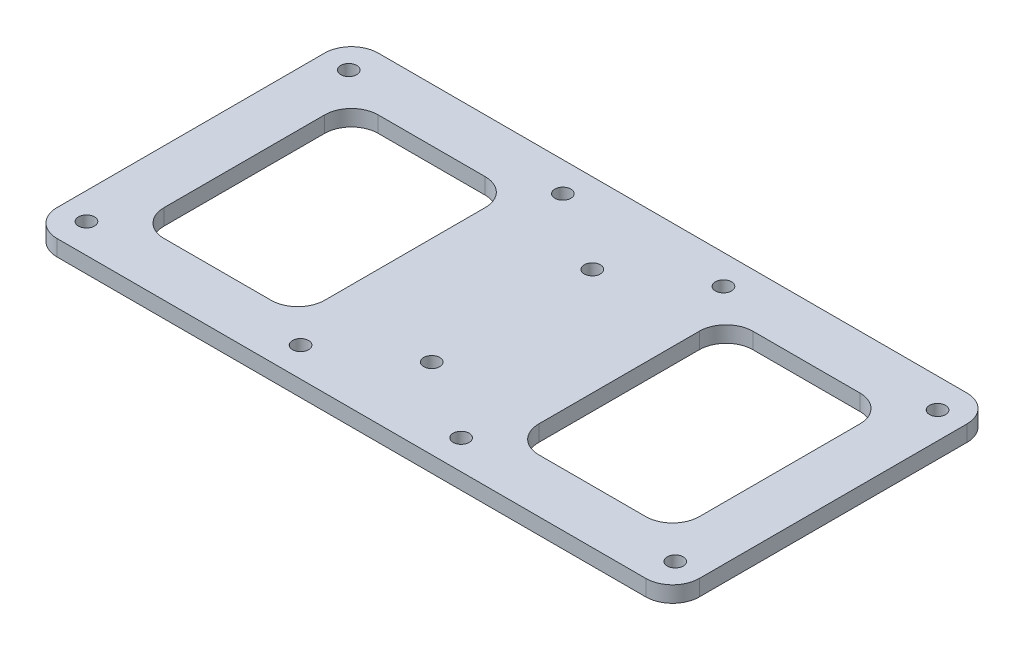
ISO-10303-21;
HEADER;
FILE_DESCRIPTION(('STEP AP214'),'2;1');
FILE_NAME('part.step','',(''),(''),'','','');
FILE_SCHEMA(('AUTOMOTIVE_DESIGN { 1 0 10303 214 1 1 1 1 }'));
ENDSEC;
DATA;
#1=APPLICATION_CONTEXT('core data for automotive mechanical design processes');
#2=APPLICATION_PROTOCOL_DEFINITION('international standard','automotive_design',2000,#1);
#3=PRODUCT_CONTEXT('',#1,'mechanical');
#4=PRODUCT('Part','Part','',(#3));
#5=PRODUCT_RELATED_PRODUCT_CATEGORY('part','',(#4));
#6=PRODUCT_DEFINITION_FORMATION('','',#4);
#7=PRODUCT_DEFINITION_CONTEXT('part definition',#1,'design');
#8=PRODUCT_DEFINITION('design','',#6,#7);
#9=PRODUCT_DEFINITION_SHAPE('','',#8);
#10=(LENGTH_UNIT() NAMED_UNIT(*) SI_UNIT(.MILLI.,.METRE.));
#11=(NAMED_UNIT(*) PLANE_ANGLE_UNIT() SI_UNIT($,.RADIAN.));
#12=(NAMED_UNIT(*) SI_UNIT($,.STERADIAN.) SOLID_ANGLE_UNIT());
#13=UNCERTAINTY_MEASURE_WITH_UNIT(LENGTH_MEASURE(1.E-05),#10,'distance_accuracy_value','');
#14=(GEOMETRIC_REPRESENTATION_CONTEXT(3) GLOBAL_UNCERTAINTY_ASSIGNED_CONTEXT((#13)) GLOBAL_UNIT_ASSIGNED_CONTEXT((#10,
#11,#12)) REPRESENTATION_CONTEXT('',''));
#15=CARTESIAN_POINT('',(0.,0.,0.));
#16=DIRECTION('',(0.,0.,1.));
#17=DIRECTION('',(1.,0.,0.));
#18=AXIS2_PLACEMENT_3D('',#15,#16,#17);
#19=CARTESIAN_POINT('',(60.,3.,30.));
#20=DIRECTION('',(-1.,0.,0.));
#21=DIRECTION('',(0.,0.,1.));
#22=AXIS2_PLACEMENT_3D('',#19,#20,#21);
#23=PLANE('',#22);
#24=DIRECTION('',(0.,0.,-1.));
#25=VECTOR('',#24,1.);
#26=CARTESIAN_POINT('',(60.,3.,30.));
#27=LINE('',#26,#25);
#28=CARTESIAN_POINT('',(60.,3.,25.));
#29=VERTEX_POINT('',#28);
#30=CARTESIAN_POINT('',(60.,3.,-25.));
#31=VERTEX_POINT('',#30);
#32=EDGE_CURVE('E216',#29,#31,#27,.T.);
#33=ORIENTED_EDGE('',*,*,#32,.F.);
#34=DIRECTION('',(0.,-1.,0.));
#35=VECTOR('',#34,1.);
#36=CARTESIAN_POINT('',(60.,3.,25.));
#37=LINE('',#36,#35);
#38=CARTESIAN_POINT('',(60.,0.,25.));
#39=VERTEX_POINT('',#38);
#40=EDGE_CURVE('E201',#29,#39,#37,.T.);
#41=ORIENTED_EDGE('',*,*,#40,.T.);
#42=DIRECTION('',(0.,0.,-1.));
#43=VECTOR('',#42,1.);
#44=CARTESIAN_POINT('',(60.,0.,30.));
#45=LINE('',#44,#43);
#46=CARTESIAN_POINT('',(60.,0.,-25.));
#47=VERTEX_POINT('',#46);
#48=EDGE_CURVE('E213',#39,#47,#45,.T.);
#49=ORIENTED_EDGE('',*,*,#48,.T.);
#50=DIRECTION('',(0.,-1.,0.));
#51=VECTOR('',#50,1.);
#52=CARTESIAN_POINT('',(60.,3.,-25.));
#53=LINE('',#52,#51);
#54=EDGE_CURVE('E218',#47,#31,#53,.F.);
#55=ORIENTED_EDGE('',*,*,#54,.T.);
#56=EDGE_LOOP('',(#33,#41,#49,#55));
#57=FACE_BOUND('',#56,.T.);
#58=ADVANCED_FACE('F35',(#57),#23,.F.);
#59=CARTESIAN_POINT('',(-60.,3.,-30.));
#60=DIRECTION('',(0.,0.,1.));
#61=DIRECTION('',(1.,0.,0.));
#62=AXIS2_PLACEMENT_3D('',#59,#60,#61);
#63=PLANE('',#62);
#64=DIRECTION('',(-1.,0.,0.));
#65=VECTOR('',#64,1.);
#66=CARTESIAN_POINT('',(-60.,3.,-30.));
#67=LINE('',#66,#65);
#68=CARTESIAN_POINT('',(55.,3.,-30.));
#69=VERTEX_POINT('',#68);
#70=CARTESIAN_POINT('',(-55.,3.,-30.));
#71=VERTEX_POINT('',#70);
#72=EDGE_CURVE('E449',#69,#71,#67,.T.);
#73=ORIENTED_EDGE('',*,*,#72,.F.);
#74=DIRECTION('',(0.,-1.,0.));
#75=VECTOR('',#74,1.);
#76=CARTESIAN_POINT('',(55.,3.,-30.));
#77=LINE('',#76,#75);
#78=CARTESIAN_POINT('',(55.,0.,-30.));
#79=VERTEX_POINT('',#78);
#80=EDGE_CURVE('E257',#69,#79,#77,.T.);
#81=ORIENTED_EDGE('',*,*,#80,.T.);
#82=DIRECTION('',(-1.,0.,0.));
#83=VECTOR('',#82,1.);
#84=CARTESIAN_POINT('',(-60.,0.,-30.));
#85=LINE('',#84,#83);
#86=CARTESIAN_POINT('',(-55.,0.,-30.));
#87=VERTEX_POINT('',#86);
#88=EDGE_CURVE('E222',#79,#87,#85,.T.);
#89=ORIENTED_EDGE('',*,*,#88,.T.);
#90=DIRECTION('',(0.,-1.,0.));
#91=VECTOR('',#90,1.);
#92=CARTESIAN_POINT('',(-55.,3.,-30.));
#93=LINE('',#92,#91);
#94=EDGE_CURVE('E255',#87,#71,#93,.F.);
#95=ORIENTED_EDGE('',*,*,#94,.T.);
#96=EDGE_LOOP('',(#73,#81,#89,#95));
#97=FACE_BOUND('',#96,.T.);
#98=ADVANCED_FACE('F474',(#97),#63,.F.);
#99=CARTESIAN_POINT('',(-60.,3.,30.));
#100=DIRECTION('',(1.,0.,0.));
#101=DIRECTION('',(0.,0.,-1.));
#102=AXIS2_PLACEMENT_3D('',#99,#100,#101);
#103=PLANE('',#102);
#104=DIRECTION('',(0.,0.,1.));
#105=VECTOR('',#104,1.);
#106=CARTESIAN_POINT('',(-60.,3.,30.));
#107=LINE('',#106,#105);
#108=CARTESIAN_POINT('',(-60.,3.,-25.));
#109=VERTEX_POINT('',#108);
#110=CARTESIAN_POINT('',(-60.,3.,25.));
#111=VERTEX_POINT('',#110);
#112=EDGE_CURVE('E451',#109,#111,#107,.T.);
#113=ORIENTED_EDGE('',*,*,#112,.F.);
#114=DIRECTION('',(0.,-1.,0.));
#115=VECTOR('',#114,1.);
#116=CARTESIAN_POINT('',(-60.,3.,-25.));
#117=LINE('',#116,#115);
#118=CARTESIAN_POINT('',(-60.,0.,-25.));
#119=VERTEX_POINT('',#118);
#120=EDGE_CURVE('E262',#109,#119,#117,.T.);
#121=ORIENTED_EDGE('',*,*,#120,.T.);
#122=DIRECTION('',(0.,0.,1.));
#123=VECTOR('',#122,1.);
#124=CARTESIAN_POINT('',(-60.,0.,30.));
#125=LINE('',#124,#123);
#126=CARTESIAN_POINT('',(-60.,0.,25.));
#127=VERTEX_POINT('',#126);
#128=EDGE_CURVE('E226',#119,#127,#125,.T.);
#129=ORIENTED_EDGE('',*,*,#128,.T.);
#130=DIRECTION('',(0.,-1.,0.));
#131=VECTOR('',#130,1.);
#132=CARTESIAN_POINT('',(-60.,3.,25.));
#133=LINE('',#132,#131);
#134=EDGE_CURVE('E260',#127,#111,#133,.F.);
#135=ORIENTED_EDGE('',*,*,#134,.T.);
#136=EDGE_LOOP('',(#113,#121,#129,#135));
#137=FACE_BOUND('',#136,.T.);
#138=ADVANCED_FACE('F466',(#137),#103,.F.);
#139=CARTESIAN_POINT('',(-60.,3.,30.));
#140=DIRECTION('',(0.,0.,-1.));
#141=DIRECTION('',(-1.,0.,0.));
#142=AXIS2_PLACEMENT_3D('',#139,#140,#141);
#143=PLANE('',#142);
#144=DIRECTION('',(1.,0.,0.));
#145=VECTOR('',#144,1.);
#146=CARTESIAN_POINT('',(-60.,0.,30.));
#147=LINE('',#146,#145);
#148=CARTESIAN_POINT('',(-55.,0.,30.));
#149=VERTEX_POINT('',#148);
#150=CARTESIAN_POINT('',(55.,0.,30.));
#151=VERTEX_POINT('',#150);
#152=EDGE_CURVE('E237',#149,#151,#147,.T.);
#153=ORIENTED_EDGE('',*,*,#152,.T.);
#154=DIRECTION('',(0.,-1.,0.));
#155=VECTOR('',#154,1.);
#156=CARTESIAN_POINT('',(55.,3.,30.));
#157=LINE('',#156,#155);
#158=CARTESIAN_POINT('',(55.,3.,30.));
#159=VERTEX_POINT('',#158);
#160=EDGE_CURVE('E202',#151,#159,#157,.F.);
#161=ORIENTED_EDGE('',*,*,#160,.T.);
#162=DIRECTION('',(1.,0.,0.));
#163=VECTOR('',#162,1.);
#164=CARTESIAN_POINT('',(-60.,3.,30.));
#165=LINE('',#164,#163);
#166=CARTESIAN_POINT('',(-55.,3.,30.));
#167=VERTEX_POINT('',#166);
#168=EDGE_CURVE('E232',#167,#159,#165,.T.);
#169=ORIENTED_EDGE('',*,*,#168,.F.);
#170=DIRECTION('',(0.,-1.,0.));
#171=VECTOR('',#170,1.);
#172=CARTESIAN_POINT('',(-55.,3.,30.));
#173=LINE('',#172,#171);
#174=EDGE_CURVE('E207',#167,#149,#173,.T.);
#175=ORIENTED_EDGE('',*,*,#174,.T.);
#176=EDGE_LOOP('',(#153,#161,#169,#175));
#177=FACE_BOUND('',#176,.T.);
#178=ADVANCED_FACE('F460',(#177),#143,.F.);
#179=CARTESIAN_POINT('',(0.,3.,0.));
#180=DIRECTION('',(0.,-1.,0.));
#181=DIRECTION('',(0.,0.,-1.));
#182=AXIS2_PLACEMENT_3D('',#179,#180,#181);
#183=PLANE('',#182);
#184=DIRECTION('',(-1.,0.,0.));
#185=VECTOR('',#184,1.);
#186=CARTESIAN_POINT('',(-50.,3.,-20.));
#187=LINE('',#186,#185);
#188=CARTESIAN_POINT('',(-25.,3.,-20.));
#189=VERTEX_POINT('',#188);
#190=CARTESIAN_POINT('',(-45.,3.,-20.));
#191=VERTEX_POINT('',#190);
#192=EDGE_CURVE('E335',#189,#191,#187,.T.);
#193=ORIENTED_EDGE('',*,*,#192,.F.);
#194=CARTESIAN_POINT('',(-25.,3.,-15.));
#195=DIRECTION('',(0.,-1.,0.));
#196=DIRECTION('',(0.,0.,-1.));
#197=AXIS2_PLACEMENT_3D('',#194,#195,#196);
#198=CIRCLE('',#197,5.);
#199=CARTESIAN_POINT('',(-20.,3.,-15.));
#200=VERTEX_POINT('',#199);
#201=EDGE_CURVE('E328',#189,#200,#198,.T.);
#202=ORIENTED_EDGE('',*,*,#201,.T.);
#203=DIRECTION('',(0.,0.,-1.));
#204=VECTOR('',#203,1.);
#205=CARTESIAN_POINT('',(-20.,3.,20.));
#206=LINE('',#205,#204);
#207=CARTESIAN_POINT('',(-20.,3.,15.));
#208=VERTEX_POINT('',#207);
#209=EDGE_CURVE('E342',#208,#200,#206,.T.);
#210=ORIENTED_EDGE('',*,*,#209,.F.);
#211=CARTESIAN_POINT('',(-25.,3.,15.));
#212=DIRECTION('',(0.,-1.,0.));
#213=DIRECTION('',(0.,0.,-1.));
#214=AXIS2_PLACEMENT_3D('',#211,#212,#213);
#215=CIRCLE('',#214,5.);
#216=CARTESIAN_POINT('',(-25.,3.,20.));
#217=VERTEX_POINT('',#216);
#218=EDGE_CURVE('E324',#208,#217,#215,.T.);
#219=ORIENTED_EDGE('',*,*,#218,.T.);
#220=DIRECTION('',(1.,0.,0.));
#221=VECTOR('',#220,1.);
#222=CARTESIAN_POINT('',(-50.,3.,20.));
#223=LINE('',#222,#221);
#224=CARTESIAN_POINT('',(-45.,3.,20.));
#225=VERTEX_POINT('',#224);
#226=EDGE_CURVE('E367',#225,#217,#223,.T.);
#227=ORIENTED_EDGE('',*,*,#226,.F.);
#228=CARTESIAN_POINT('',(-45.,3.,15.));
#229=DIRECTION('',(0.,-1.,0.));
#230=DIRECTION('',(0.,0.,-1.));
#231=AXIS2_PLACEMENT_3D('',#228,#229,#230);
#232=CIRCLE('',#231,5.);
#233=CARTESIAN_POINT('',(-50.,3.,15.));
#234=VERTEX_POINT('',#233);
#235=EDGE_CURVE('E320',#225,#234,#232,.T.);
#236=ORIENTED_EDGE('',*,*,#235,.T.);
#237=DIRECTION('',(0.,0.,1.));
#238=VECTOR('',#237,1.);
#239=CARTESIAN_POINT('',(-50.,3.,20.));
#240=LINE('',#239,#238);
#241=CARTESIAN_POINT('',(-50.,3.,-15.));
#242=VERTEX_POINT('',#241);
#243=EDGE_CURVE('E337',#242,#234,#240,.T.);
#244=ORIENTED_EDGE('',*,*,#243,.F.);
#245=CARTESIAN_POINT('',(-45.,3.,-15.));
#246=DIRECTION('',(0.,-1.,0.));
#247=DIRECTION('',(0.,0.,-1.));
#248=AXIS2_PLACEMENT_3D('',#245,#246,#247);
#249=CIRCLE('',#248,5.);
#250=EDGE_CURVE('E43',#242,#191,#249,.T.);
#251=ORIENTED_EDGE('',*,*,#250,.T.);
#252=EDGE_LOOP('',(#193,#202,#210,#219,#227,#236,#244,#251));
#253=FACE_BOUND('',#252,.T.);
#254=DIRECTION('',(-1.,0.,0.));
#255=VECTOR('',#254,1.);
#256=CARTESIAN_POINT('',(50.,3.,-20.));
#257=LINE('',#256,#255);
#258=CARTESIAN_POINT('',(45.,3.,-20.));
#259=VERTEX_POINT('',#258);
#260=CARTESIAN_POINT('',(25.,3.,-20.));
#261=VERTEX_POINT('',#260);
#262=EDGE_CURVE('E385',#259,#261,#257,.T.);
#263=ORIENTED_EDGE('',*,*,#262,.F.);
#264=CARTESIAN_POINT('',(45.,3.,-15.));
#265=DIRECTION('',(0.,-1.,0.));
#266=DIRECTION('',(0.,0.,-1.));
#267=AXIS2_PLACEMENT_3D('',#264,#265,#266);
#268=CIRCLE('',#267,5.);
#269=CARTESIAN_POINT('',(50.,3.,-15.));
#270=VERTEX_POINT('',#269);
#271=EDGE_CURVE('E308',#259,#270,#268,.T.);
#272=ORIENTED_EDGE('',*,*,#271,.T.);
#273=DIRECTION('',(0.,0.,-1.));
#274=VECTOR('',#273,1.);
#275=CARTESIAN_POINT('',(50.,3.,20.));
#276=LINE('',#275,#274);
#277=CARTESIAN_POINT('',(50.,3.,15.));
#278=VERTEX_POINT('',#277);
#279=EDGE_CURVE('E382',#278,#270,#276,.T.);
#280=ORIENTED_EDGE('',*,*,#279,.F.);
#281=CARTESIAN_POINT('',(45.,3.,15.));
#282=DIRECTION('',(0.,-1.,0.));
#283=DIRECTION('',(0.,0.,-1.));
#284=AXIS2_PLACEMENT_3D('',#281,#282,#283);
#285=CIRCLE('',#284,5.);
#286=CARTESIAN_POINT('',(45.,3.,20.));
#287=VERTEX_POINT('',#286);
#288=EDGE_CURVE('E304',#278,#287,#285,.T.);
#289=ORIENTED_EDGE('',*,*,#288,.T.);
#290=DIRECTION('',(1.,0.,0.));
#291=VECTOR('',#290,1.);
#292=CARTESIAN_POINT('',(50.,3.,20.));
#293=LINE('',#292,#291);
#294=CARTESIAN_POINT('',(25.,3.,20.));
#295=VERTEX_POINT('',#294);
#296=EDGE_CURVE('E374',#295,#287,#293,.T.);
#297=ORIENTED_EDGE('',*,*,#296,.F.);
#298=CARTESIAN_POINT('',(25.,3.,15.));
#299=DIRECTION('',(0.,-1.,0.));
#300=DIRECTION('',(0.,0.,-1.));
#301=AXIS2_PLACEMENT_3D('',#298,#299,#300);
#302=CIRCLE('',#301,5.);
#303=CARTESIAN_POINT('',(20.,3.,15.));
#304=VERTEX_POINT('',#303);
#305=EDGE_CURVE('E316',#295,#304,#302,.T.);
#306=ORIENTED_EDGE('',*,*,#305,.T.);
#307=DIRECTION('',(0.,0.,1.));
#308=VECTOR('',#307,1.);
#309=CARTESIAN_POINT('',(20.,3.,20.));
#310=LINE('',#309,#308);
#311=CARTESIAN_POINT('',(20.,3.,-15.));
#312=VERTEX_POINT('',#311);
#313=EDGE_CURVE('E388',#312,#304,#310,.T.);
#314=ORIENTED_EDGE('',*,*,#313,.F.);
#315=CARTESIAN_POINT('',(25.,3.,-15.));
#316=DIRECTION('',(0.,-1.,0.));
#317=DIRECTION('',(0.,0.,-1.));
#318=AXIS2_PLACEMENT_3D('',#315,#316,#317);
#319=CIRCLE('',#318,5.);
#320=EDGE_CURVE('E312',#312,#261,#319,.T.);
#321=ORIENTED_EDGE('',*,*,#320,.T.);
#322=EDGE_LOOP('',(#263,#272,#280,#289,#297,#306,#314,#321));
#323=FACE_BOUND('',#322,.T.);
#324=CARTESIAN_POINT('',(0.,3.,-15.));
#325=DIRECTION('',(0.,1.,0.));
#326=DIRECTION('',(0.,0.,1.));
#327=AXIS2_PLACEMENT_3D('',#324,#325,#326);
#328=CIRCLE('',#327,1.5);
#329=CARTESIAN_POINT('',(0.,3.,-13.5));
#330=VERTEX_POINT('',#329);
#331=EDGE_CURVE('E397',#330,#330,#328,.T.);
#332=ORIENTED_EDGE('',*,*,#331,.F.);
#333=EDGE_LOOP('',(#332));
#334=FACE_BOUND('',#333,.T.);
#335=CARTESIAN_POINT('',(0.,3.,15.));
#336=DIRECTION('',(0.,1.,0.));
#337=DIRECTION('',(0.,0.,-1.));
#338=AXIS2_PLACEMENT_3D('',#335,#336,#337);
#339=CIRCLE('',#338,1.5);
#340=CARTESIAN_POINT('',(0.,3.,13.5));
#341=VERTEX_POINT('',#340);
#342=EDGE_CURVE('E357',#341,#341,#339,.T.);
#343=ORIENTED_EDGE('',*,*,#342,.F.);
#344=EDGE_LOOP('',(#343));
#345=FACE_BOUND('',#344,.T.);
#346=CARTESIAN_POINT('',(15.,3.,24.5));
#347=DIRECTION('',(0.,1.,0.));
#348=DIRECTION('',(0.,0.,1.));
#349=AXIS2_PLACEMENT_3D('',#346,#347,#348);
#350=CIRCLE('',#349,1.49999999999999);
#351=CARTESIAN_POINT('',(15.,3.,26.));
#352=VERTEX_POINT('',#351);
#353=EDGE_CURVE('E414',#352,#352,#350,.T.);
#354=ORIENTED_EDGE('',*,*,#353,.F.);
#355=EDGE_LOOP('',(#354));
#356=FACE_BOUND('',#355,.T.);
#357=CARTESIAN_POINT('',(-15.,3.,24.5));
#358=DIRECTION('',(0.,1.,0.));
#359=DIRECTION('',(0.,0.,-1.));
#360=AXIS2_PLACEMENT_3D('',#357,#358,#359);
#361=CIRCLE('',#360,1.49999999999999);
#362=CARTESIAN_POINT('',(-15.,3.,23.));
#363=VERTEX_POINT('',#362);
#364=EDGE_CURVE('E427',#363,#363,#361,.T.);
#365=ORIENTED_EDGE('',*,*,#364,.F.);
#366=EDGE_LOOP('',(#365));
#367=FACE_BOUND('',#366,.T.);
#368=CARTESIAN_POINT('',(-55.,3.,24.5));
#369=DIRECTION('',(0.,1.,0.));
#370=DIRECTION('',(0.,0.,-1.));
#371=AXIS2_PLACEMENT_3D('',#368,#369,#370);
#372=CIRCLE('',#371,1.5);
#373=CARTESIAN_POINT('',(-55.,3.,23.));
#374=VERTEX_POINT('',#373);
#375=EDGE_CURVE('E426',#374,#374,#372,.T.);
#376=ORIENTED_EDGE('',*,*,#375,.F.);
#377=EDGE_LOOP('',(#376));
#378=FACE_BOUND('',#377,.T.);
#379=CARTESIAN_POINT('',(-15.,3.,-24.5));
#380=DIRECTION('',(0.,1.,0.));
#381=DIRECTION('',(0.,0.,1.));
#382=AXIS2_PLACEMENT_3D('',#379,#380,#381);
#383=CIRCLE('',#382,1.5);
#384=CARTESIAN_POINT('',(-15.,3.,-23.));
#385=VERTEX_POINT('',#384);
#386=EDGE_CURVE('E438',#385,#385,#383,.T.);
#387=ORIENTED_EDGE('',*,*,#386,.F.);
#388=EDGE_LOOP('',(#387));
#389=FACE_BOUND('',#388,.T.);
#390=CARTESIAN_POINT('',(55.,3.,-24.5));
#391=DIRECTION('',(0.,1.,0.));
#392=DIRECTION('',(0.,0.,-1.));
#393=AXIS2_PLACEMENT_3D('',#390,#391,#392);
#394=CIRCLE('',#393,1.5);
#395=CARTESIAN_POINT('',(55.,3.,-26.));
#396=VERTEX_POINT('',#395);
#397=EDGE_CURVE('E396',#396,#396,#394,.T.);
#398=ORIENTED_EDGE('',*,*,#397,.F.);
#399=EDGE_LOOP('',(#398));
#400=FACE_BOUND('',#399,.T.);
#401=CARTESIAN_POINT('',(15.,3.,-24.5));
#402=DIRECTION('',(0.,1.,0.));
#403=DIRECTION('',(0.,0.,-1.));
#404=AXIS2_PLACEMENT_3D('',#401,#402,#403);
#405=CIRCLE('',#404,1.5);
#406=CARTESIAN_POINT('',(15.,3.,-26.));
#407=VERTEX_POINT('',#406);
#408=EDGE_CURVE('E408',#407,#407,#405,.T.);
#409=ORIENTED_EDGE('',*,*,#408,.F.);
#410=EDGE_LOOP('',(#409));
#411=FACE_BOUND('',#410,.T.);
#412=CARTESIAN_POINT('',(55.,3.,24.5));
#413=DIRECTION('',(0.,1.,0.));
#414=DIRECTION('',(0.,0.,1.));
#415=AXIS2_PLACEMENT_3D('',#412,#413,#414);
#416=CIRCLE('',#415,1.5);
#417=CARTESIAN_POINT('',(55.,3.,26.));
#418=VERTEX_POINT('',#417);
#419=EDGE_CURVE('E415',#418,#418,#416,.T.);
#420=ORIENTED_EDGE('',*,*,#419,.F.);
#421=EDGE_LOOP('',(#420));
#422=FACE_BOUND('',#421,.T.);
#423=CARTESIAN_POINT('',(-55.,3.,-24.5));
#424=DIRECTION('',(0.,1.,0.));
#425=DIRECTION('',(0.,0.,1.));
#426=AXIS2_PLACEMENT_3D('',#423,#424,#425);
#427=CIRCLE('',#426,1.5);
#428=CARTESIAN_POINT('',(-55.,3.,-23.));
#429=VERTEX_POINT('',#428);
#430=EDGE_CURVE('E229',#429,#429,#427,.T.);
#431=ORIENTED_EDGE('',*,*,#430,.F.);
#432=EDGE_LOOP('',(#431));
#433=FACE_BOUND('',#432,.T.);
#434=ORIENTED_EDGE('',*,*,#168,.T.);
#435=CARTESIAN_POINT('',(55.,3.,25.));
#436=DIRECTION('',(0.,-1.,0.));
#437=DIRECTION('',(0.,0.,-1.));
#438=AXIS2_PLACEMENT_3D('',#435,#436,#437);
#439=CIRCLE('',#438,5.);
#440=EDGE_CURVE('E253',#159,#29,#439,.F.);
#441=ORIENTED_EDGE('',*,*,#440,.T.);
#442=ORIENTED_EDGE('',*,*,#32,.T.);
#443=CARTESIAN_POINT('',(55.,3.,-25.));
#444=DIRECTION('',(0.,-1.,0.));
#445=DIRECTION('',(0.,0.,-1.));
#446=AXIS2_PLACEMENT_3D('',#443,#444,#445);
#447=CIRCLE('',#446,5.);
#448=EDGE_CURVE('E251',#31,#69,#447,.F.);
#449=ORIENTED_EDGE('',*,*,#448,.T.);
#450=ORIENTED_EDGE('',*,*,#72,.T.);
#451=CARTESIAN_POINT('',(-55.,3.,-25.));
#452=DIRECTION('',(0.,-1.,0.));
#453=DIRECTION('',(0.,0.,-1.));
#454=AXIS2_PLACEMENT_3D('',#451,#452,#453);
#455=CIRCLE('',#454,5.);
#456=EDGE_CURVE('E249',#71,#109,#455,.F.);
#457=ORIENTED_EDGE('',*,*,#456,.T.);
#458=ORIENTED_EDGE('',*,*,#112,.T.);
#459=CARTESIAN_POINT('',(-55.,3.,25.));
#460=DIRECTION('',(0.,-1.,0.));
#461=DIRECTION('',(0.,0.,-1.));
#462=AXIS2_PLACEMENT_3D('',#459,#460,#461);
#463=CIRCLE('',#462,5.);
#464=EDGE_CURVE('E247',#111,#167,#463,.F.);
#465=ORIENTED_EDGE('',*,*,#464,.T.);
#466=EDGE_LOOP('',(#434,#441,#442,#449,#450,#457,#458,#465));
#467=FACE_BOUND('',#466,.T.);
#468=ADVANCED_FACE('F333',(#253,#323,#334,#345,#356,#367,#378,#389,#400,#411,#422,#433,#467),
#183,.F.);
#469=CARTESIAN_POINT('',(0.,0.,0.));
#470=DIRECTION('',(0.,-1.,0.));
#471=DIRECTION('',(0.,0.,-1.));
#472=AXIS2_PLACEMENT_3D('',#469,#470,#471);
#473=PLANE('',#472);
#474=DIRECTION('',(1.,0.,0.));
#475=VECTOR('',#474,1.);
#476=CARTESIAN_POINT('',(-50.,0.,20.));
#477=LINE('',#476,#475);
#478=CARTESIAN_POINT('',(-45.,0.,20.));
#479=VERTEX_POINT('',#478);
#480=CARTESIAN_POINT('',(-25.,0.,20.));
#481=VERTEX_POINT('',#480);
#482=EDGE_CURVE('E355',#479,#481,#477,.T.);
#483=ORIENTED_EDGE('',*,*,#482,.T.);
#484=CARTESIAN_POINT('',(-25.,0.,15.));
#485=DIRECTION('',(0.,-1.,0.));
#486=DIRECTION('',(0.,0.,-1.));
#487=AXIS2_PLACEMENT_3D('',#484,#485,#486);
#488=CIRCLE('',#487,5.);
#489=CARTESIAN_POINT('',(-20.,0.,15.));
#490=VERTEX_POINT('',#489);
#491=EDGE_CURVE('E326',#481,#490,#488,.F.);
#492=ORIENTED_EDGE('',*,*,#491,.T.);
#493=DIRECTION('',(0.,0.,-1.));
#494=VECTOR('',#493,1.);
#495=CARTESIAN_POINT('',(-20.,0.,20.));
#496=LINE('',#495,#494);
#497=CARTESIAN_POINT('',(-20.,0.,-15.));
#498=VERTEX_POINT('',#497);
#499=EDGE_CURVE('E359',#490,#498,#496,.T.);
#500=ORIENTED_EDGE('',*,*,#499,.T.);
#501=CARTESIAN_POINT('',(-25.,0.,-15.));
#502=DIRECTION('',(0.,-1.,0.));
#503=DIRECTION('',(0.,0.,-1.));
#504=AXIS2_PLACEMENT_3D('',#501,#502,#503);
#505=CIRCLE('',#504,5.);
#506=CARTESIAN_POINT('',(-25.,0.,-20.));
#507=VERTEX_POINT('',#506);
#508=EDGE_CURVE('E57',#498,#507,#505,.F.);
#509=ORIENTED_EDGE('',*,*,#508,.T.);
#510=DIRECTION('',(-1.,0.,0.));
#511=VECTOR('',#510,1.);
#512=CARTESIAN_POINT('',(-50.,0.,-20.));
#513=LINE('',#512,#511);
#514=CARTESIAN_POINT('',(-45.,0.,-20.));
#515=VERTEX_POINT('',#514);
#516=EDGE_CURVE('E351',#507,#515,#513,.T.);
#517=ORIENTED_EDGE('',*,*,#516,.T.);
#518=CARTESIAN_POINT('',(-45.,0.,-15.));
#519=DIRECTION('',(0.,-1.,0.));
#520=DIRECTION('',(0.,0.,-1.));
#521=AXIS2_PLACEMENT_3D('',#518,#519,#520);
#522=CIRCLE('',#521,5.);
#523=CARTESIAN_POINT('',(-50.,0.,-15.));
#524=VERTEX_POINT('',#523);
#525=EDGE_CURVE('E11',#515,#524,#522,.F.);
#526=ORIENTED_EDGE('',*,*,#525,.T.);
#527=DIRECTION('',(0.,0.,1.));
#528=VECTOR('',#527,1.);
#529=CARTESIAN_POINT('',(-50.,0.,20.));
#530=LINE('',#529,#528);
#531=CARTESIAN_POINT('',(-50.,0.,15.));
#532=VERTEX_POINT('',#531);
#533=EDGE_CURVE('E349',#524,#532,#530,.T.);
#534=ORIENTED_EDGE('',*,*,#533,.T.);
#535=CARTESIAN_POINT('',(-45.,0.,15.));
#536=DIRECTION('',(0.,-1.,0.));
#537=DIRECTION('',(0.,0.,-1.));
#538=AXIS2_PLACEMENT_3D('',#535,#536,#537);
#539=CIRCLE('',#538,5.);
#540=EDGE_CURVE('E322',#532,#479,#539,.F.);
#541=ORIENTED_EDGE('',*,*,#540,.T.);
#542=EDGE_LOOP('',(#483,#492,#500,#509,#517,#526,#534,#541));
#543=FACE_BOUND('',#542,.T.);
#544=DIRECTION('',(1.,0.,0.));
#545=VECTOR('',#544,1.);
#546=CARTESIAN_POINT('',(50.,0.,20.));
#547=LINE('',#546,#545);
#548=CARTESIAN_POINT('',(25.,0.,20.));
#549=VERTEX_POINT('',#548);
#550=CARTESIAN_POINT('',(45.,0.,20.));
#551=VERTEX_POINT('',#550);
#552=EDGE_CURVE('E364',#549,#551,#547,.T.);
#553=ORIENTED_EDGE('',*,*,#552,.T.);
#554=CARTESIAN_POINT('',(45.,0.,15.));
#555=DIRECTION('',(0.,-1.,0.));
#556=DIRECTION('',(0.,0.,-1.));
#557=AXIS2_PLACEMENT_3D('',#554,#555,#556);
#558=CIRCLE('',#557,5.);
#559=CARTESIAN_POINT('',(50.,0.,15.));
#560=VERTEX_POINT('',#559);
#561=EDGE_CURVE('E306',#551,#560,#558,.F.);
#562=ORIENTED_EDGE('',*,*,#561,.T.);
#563=DIRECTION('',(0.,0.,-1.));
#564=VECTOR('',#563,1.);
#565=CARTESIAN_POINT('',(50.,0.,20.));
#566=LINE('',#565,#564);
#567=CARTESIAN_POINT('',(50.,0.,-15.));
#568=VERTEX_POINT('',#567);
#569=EDGE_CURVE('E370',#560,#568,#566,.T.);
#570=ORIENTED_EDGE('',*,*,#569,.T.);
#571=CARTESIAN_POINT('',(45.,0.,-15.));
#572=DIRECTION('',(0.,-1.,0.));
#573=DIRECTION('',(0.,0.,-1.));
#574=AXIS2_PLACEMENT_3D('',#571,#572,#573);
#575=CIRCLE('',#574,5.);
#576=CARTESIAN_POINT('',(45.,0.,-20.));
#577=VERTEX_POINT('',#576);
#578=EDGE_CURVE('E310',#568,#577,#575,.F.);
#579=ORIENTED_EDGE('',*,*,#578,.T.);
#580=DIRECTION('',(-1.,0.,0.));
#581=VECTOR('',#580,1.);
#582=CARTESIAN_POINT('',(50.,0.,-20.));
#583=LINE('',#582,#581);
#584=CARTESIAN_POINT('',(25.,0.,-20.));
#585=VERTEX_POINT('',#584);
#586=EDGE_CURVE('E373',#577,#585,#583,.T.);
#587=ORIENTED_EDGE('',*,*,#586,.T.);
#588=CARTESIAN_POINT('',(25.,0.,-15.));
#589=DIRECTION('',(0.,-1.,0.));
#590=DIRECTION('',(0.,0.,-1.));
#591=AXIS2_PLACEMENT_3D('',#588,#589,#590);
#592=CIRCLE('',#591,5.);
#593=CARTESIAN_POINT('',(20.,0.,-15.));
#594=VERTEX_POINT('',#593);
#595=EDGE_CURVE('E314',#585,#594,#592,.F.);
#596=ORIENTED_EDGE('',*,*,#595,.T.);
#597=DIRECTION('',(0.,0.,1.));
#598=VECTOR('',#597,1.);
#599=CARTESIAN_POINT('',(20.,0.,20.));
#600=LINE('',#599,#598);
#601=CARTESIAN_POINT('',(20.,0.,15.));
#602=VERTEX_POINT('',#601);
#603=EDGE_CURVE('E377',#594,#602,#600,.T.);
#604=ORIENTED_EDGE('',*,*,#603,.T.);
#605=CARTESIAN_POINT('',(25.,0.,15.));
#606=DIRECTION('',(0.,-1.,0.));
#607=DIRECTION('',(0.,0.,-1.));
#608=AXIS2_PLACEMENT_3D('',#605,#606,#607);
#609=CIRCLE('',#608,5.);
#610=EDGE_CURVE('E318',#602,#549,#609,.F.);
#611=ORIENTED_EDGE('',*,*,#610,.T.);
#612=EDGE_LOOP('',(#553,#562,#570,#579,#587,#596,#604,#611));
#613=FACE_BOUND('',#612,.T.);
#614=CARTESIAN_POINT('',(0.,0.,-15.));
#615=DIRECTION('',(0.,1.,0.));
#616=DIRECTION('',(0.,0.,1.));
#617=AXIS2_PLACEMENT_3D('',#614,#615,#616);
#618=CIRCLE('',#617,1.5);
#619=CARTESIAN_POINT('',(0.,0.,-13.5));
#620=VERTEX_POINT('',#619);
#621=EDGE_CURVE('E393',#620,#620,#618,.T.);
#622=ORIENTED_EDGE('',*,*,#621,.T.);
#623=EDGE_LOOP('',(#622));
#624=FACE_BOUND('',#623,.T.);
#625=CARTESIAN_POINT('',(0.,0.,15.));
#626=DIRECTION('',(0.,1.,0.));
#627=DIRECTION('',(0.,0.,-1.));
#628=AXIS2_PLACEMENT_3D('',#625,#626,#627);
#629=CIRCLE('',#628,1.5);
#630=CARTESIAN_POINT('',(0.,0.,13.5));
#631=VERTEX_POINT('',#630);
#632=EDGE_CURVE('E400',#631,#631,#629,.T.);
#633=ORIENTED_EDGE('',*,*,#632,.T.);
#634=EDGE_LOOP('',(#633));
#635=FACE_BOUND('',#634,.T.);
#636=CARTESIAN_POINT('',(15.,0.,24.5));
#637=DIRECTION('',(0.,1.,0.));
#638=DIRECTION('',(0.,0.,1.));
#639=AXIS2_PLACEMENT_3D('',#636,#637,#638);
#640=CIRCLE('',#639,1.49999999999999);
#641=CARTESIAN_POINT('',(15.,0.,26.));
#642=VERTEX_POINT('',#641);
#643=EDGE_CURVE('E430',#642,#642,#640,.T.);
#644=ORIENTED_EDGE('',*,*,#643,.T.);
#645=EDGE_LOOP('',(#644));
#646=FACE_BOUND('',#645,.T.);
#647=CARTESIAN_POINT('',(-15.,0.,24.5));
#648=DIRECTION('',(0.,1.,0.));
#649=DIRECTION('',(0.,0.,-1.));
#650=AXIS2_PLACEMENT_3D('',#647,#648,#649);
#651=CIRCLE('',#650,1.49999999999999);
#652=CARTESIAN_POINT('',(-15.,0.,23.));
#653=VERTEX_POINT('',#652);
#654=EDGE_CURVE('E423',#653,#653,#651,.T.);
#655=ORIENTED_EDGE('',*,*,#654,.T.);
#656=EDGE_LOOP('',(#655));
#657=FACE_BOUND('',#656,.T.);
#658=CARTESIAN_POINT('',(-55.,0.,24.5));
#659=DIRECTION('',(0.,1.,0.));
#660=DIRECTION('',(0.,0.,-1.));
#661=AXIS2_PLACEMENT_3D('',#658,#659,#660);
#662=CIRCLE('',#661,1.5);
#663=CARTESIAN_POINT('',(-55.,0.,23.));
#664=VERTEX_POINT('',#663);
#665=EDGE_CURVE('E441',#664,#664,#662,.T.);
#666=ORIENTED_EDGE('',*,*,#665,.T.);
#667=EDGE_LOOP('',(#666));
#668=FACE_BOUND('',#667,.T.);
#669=CARTESIAN_POINT('',(-15.,0.,-24.5));
#670=DIRECTION('',(0.,1.,0.));
#671=DIRECTION('',(0.,0.,1.));
#672=AXIS2_PLACEMENT_3D('',#669,#670,#671);
#673=CIRCLE('',#672,1.5);
#674=CARTESIAN_POINT('',(-15.,0.,-23.));
#675=VERTEX_POINT('',#674);
#676=EDGE_CURVE('E435',#675,#675,#673,.T.);
#677=ORIENTED_EDGE('',*,*,#676,.T.);
#678=EDGE_LOOP('',(#677));
#679=FACE_BOUND('',#678,.T.);
#680=CARTESIAN_POINT('',(55.,0.,-24.5));
#681=DIRECTION('',(0.,1.,0.));
#682=DIRECTION('',(0.,0.,-1.));
#683=AXIS2_PLACEMENT_3D('',#680,#681,#682);
#684=CIRCLE('',#683,1.5);
#685=CARTESIAN_POINT('',(55.,0.,-26.));
#686=VERTEX_POINT('',#685);
#687=EDGE_CURVE('E405',#686,#686,#684,.T.);
#688=ORIENTED_EDGE('',*,*,#687,.T.);
#689=EDGE_LOOP('',(#688));
#690=FACE_BOUND('',#689,.T.);
#691=CARTESIAN_POINT('',(15.,0.,-24.5));
#692=DIRECTION('',(0.,1.,0.));
#693=DIRECTION('',(0.,0.,-1.));
#694=AXIS2_PLACEMENT_3D('',#691,#692,#693);
#695=CIRCLE('',#694,1.5);
#696=CARTESIAN_POINT('',(15.,0.,-26.));
#697=VERTEX_POINT('',#696);
#698=EDGE_CURVE('E418',#697,#697,#695,.T.);
#699=ORIENTED_EDGE('',*,*,#698,.T.);
#700=EDGE_LOOP('',(#699));
#701=FACE_BOUND('',#700,.T.);
#702=CARTESIAN_POINT('',(55.,0.,24.5));
#703=DIRECTION('',(0.,1.,0.));
#704=DIRECTION('',(0.,0.,1.));
#705=AXIS2_PLACEMENT_3D('',#702,#703,#704);
#706=CIRCLE('',#705,1.5);
#707=CARTESIAN_POINT('',(55.,0.,26.));
#708=VERTEX_POINT('',#707);
#709=EDGE_CURVE('E411',#708,#708,#706,.T.);
#710=ORIENTED_EDGE('',*,*,#709,.T.);
#711=EDGE_LOOP('',(#710));
#712=FACE_BOUND('',#711,.T.);
#713=CARTESIAN_POINT('',(-55.,0.,-24.5));
#714=DIRECTION('',(0.,1.,0.));
#715=DIRECTION('',(0.,0.,1.));
#716=AXIS2_PLACEMENT_3D('',#713,#714,#715);
#717=CIRCLE('',#716,1.5);
#718=CARTESIAN_POINT('',(-55.,0.,-23.));
#719=VERTEX_POINT('',#718);
#720=EDGE_CURVE('E223',#719,#719,#717,.T.);
#721=ORIENTED_EDGE('',*,*,#720,.T.);
#722=EDGE_LOOP('',(#721));
#723=FACE_BOUND('',#722,.T.);
#724=ORIENTED_EDGE('',*,*,#48,.F.);
#725=CARTESIAN_POINT('',(55.,0.,25.));
#726=DIRECTION('',(0.,-1.,0.));
#727=DIRECTION('',(0.,0.,-1.));
#728=AXIS2_PLACEMENT_3D('',#725,#726,#727);
#729=CIRCLE('',#728,5.);
#730=EDGE_CURVE('E197',#39,#151,#729,.T.);
#731=ORIENTED_EDGE('',*,*,#730,.T.);
#732=ORIENTED_EDGE('',*,*,#152,.F.);
#733=CARTESIAN_POINT('',(-55.,0.,25.));
#734=DIRECTION('',(0.,-1.,0.));
#735=DIRECTION('',(0.,0.,-1.));
#736=AXIS2_PLACEMENT_3D('',#733,#734,#735);
#737=CIRCLE('',#736,5.);
#738=EDGE_CURVE('E217',#149,#127,#737,.T.);
#739=ORIENTED_EDGE('',*,*,#738,.T.);
#740=ORIENTED_EDGE('',*,*,#128,.F.);
#741=CARTESIAN_POINT('',(-55.,0.,-25.));
#742=DIRECTION('',(0.,-1.,0.));
#743=DIRECTION('',(0.,0.,-1.));
#744=AXIS2_PLACEMENT_3D('',#741,#742,#743);
#745=CIRCLE('',#744,5.);
#746=EDGE_CURVE('E241',#119,#87,#745,.T.);
#747=ORIENTED_EDGE('',*,*,#746,.T.);
#748=ORIENTED_EDGE('',*,*,#88,.F.);
#749=CARTESIAN_POINT('',(55.,0.,-25.));
#750=DIRECTION('',(0.,-1.,0.));
#751=DIRECTION('',(0.,0.,-1.));
#752=AXIS2_PLACEMENT_3D('',#749,#750,#751);
#753=CIRCLE('',#752,5.);
#754=EDGE_CURVE('E208',#79,#47,#753,.T.);
#755=ORIENTED_EDGE('',*,*,#754,.T.);
#756=EDGE_LOOP('',(#724,#731,#732,#739,#740,#747,#748,#755));
#757=FACE_BOUND('',#756,.T.);
#758=ADVANCED_FACE('F220',(#543,#613,#624,#635,#646,#657,#668,#679,#690,#701,#712,#723,#757),
#473,.T.);
#759=CARTESIAN_POINT('',(-55.,0.,-24.5));
#760=DIRECTION('',(0.,1.,0.));
#761=DIRECTION('',(0.,0.,1.));
#762=AXIS2_PLACEMENT_3D('',#759,#760,#761);
#763=CYLINDRICAL_SURFACE('',#762,1.5);
#764=ORIENTED_EDGE('',*,*,#720,.F.);
#765=EDGE_LOOP('',(#764));
#766=FACE_BOUND('',#765,.T.);
#767=ORIENTED_EDGE('',*,*,#430,.T.);
#768=EDGE_LOOP('',(#767));
#769=FACE_BOUND('',#768,.T.);
#770=ADVANCED_FACE('F502',(#766,#769),#763,.F.);
#771=CARTESIAN_POINT('',(55.,0.,24.5));
#772=DIRECTION('',(0.,1.,0.));
#773=DIRECTION('',(0.,0.,1.));
#774=AXIS2_PLACEMENT_3D('',#771,#772,#773);
#775=CYLINDRICAL_SURFACE('',#774,1.5);
#776=ORIENTED_EDGE('',*,*,#709,.F.);
#777=EDGE_LOOP('',(#776));
#778=FACE_BOUND('',#777,.T.);
#779=ORIENTED_EDGE('',*,*,#419,.T.);
#780=EDGE_LOOP('',(#779));
#781=FACE_BOUND('',#780,.T.);
#782=ADVANCED_FACE('F507',(#778,#781),#775,.F.);
#783=CARTESIAN_POINT('',(15.,0.,-24.5));
#784=DIRECTION('',(0.,1.,0.));
#785=DIRECTION('',(0.,0.,1.));
#786=AXIS2_PLACEMENT_3D('',#783,#784,#785);
#787=CYLINDRICAL_SURFACE('',#786,1.5);
#788=ORIENTED_EDGE('',*,*,#698,.F.);
#789=EDGE_LOOP('',(#788));
#790=FACE_BOUND('',#789,.T.);
#791=ORIENTED_EDGE('',*,*,#408,.T.);
#792=EDGE_LOOP('',(#791));
#793=FACE_BOUND('',#792,.T.);
#794=ADVANCED_FACE('F527',(#790,#793),#787,.F.);
#795=CARTESIAN_POINT('',(55.,0.,-24.5));
#796=DIRECTION('',(0.,1.,0.));
#797=DIRECTION('',(0.,0.,1.));
#798=AXIS2_PLACEMENT_3D('',#795,#796,#797);
#799=CYLINDRICAL_SURFACE('',#798,1.5);
#800=ORIENTED_EDGE('',*,*,#687,.F.);
#801=EDGE_LOOP('',(#800));
#802=FACE_BOUND('',#801,.T.);
#803=ORIENTED_EDGE('',*,*,#397,.T.);
#804=EDGE_LOOP('',(#803));
#805=FACE_BOUND('',#804,.T.);
#806=ADVANCED_FACE('F517',(#802,#805),#799,.F.);
#807=CARTESIAN_POINT('',(-15.,0.,-24.5));
#808=DIRECTION('',(0.,1.,0.));
#809=DIRECTION('',(0.,0.,1.));
#810=AXIS2_PLACEMENT_3D('',#807,#808,#809);
#811=CYLINDRICAL_SURFACE('',#810,1.5);
#812=ORIENTED_EDGE('',*,*,#676,.F.);
#813=EDGE_LOOP('',(#812));
#814=FACE_BOUND('',#813,.T.);
#815=ORIENTED_EDGE('',*,*,#386,.T.);
#816=EDGE_LOOP('',(#815));
#817=FACE_BOUND('',#816,.T.);
#818=ADVANCED_FACE('F513',(#814,#817),#811,.F.);
#819=CARTESIAN_POINT('',(-55.,0.,24.5));
#820=DIRECTION('',(0.,1.,0.));
#821=DIRECTION('',(0.,0.,1.));
#822=AXIS2_PLACEMENT_3D('',#819,#820,#821);
#823=CYLINDRICAL_SURFACE('',#822,1.5);
#824=ORIENTED_EDGE('',*,*,#665,.F.);
#825=EDGE_LOOP('',(#824));
#826=FACE_BOUND('',#825,.T.);
#827=ORIENTED_EDGE('',*,*,#375,.T.);
#828=EDGE_LOOP('',(#827));
#829=FACE_BOUND('',#828,.T.);
#830=ADVANCED_FACE('F509',(#826,#829),#823,.F.);
#831=CARTESIAN_POINT('',(-15.,0.,24.5));
#832=DIRECTION('',(0.,1.,0.));
#833=DIRECTION('',(0.,0.,1.));
#834=AXIS2_PLACEMENT_3D('',#831,#832,#833);
#835=CYLINDRICAL_SURFACE('',#834,1.49999999999999);
#836=ORIENTED_EDGE('',*,*,#654,.F.);
#837=EDGE_LOOP('',(#836));
#838=FACE_BOUND('',#837,.T.);
#839=ORIENTED_EDGE('',*,*,#364,.T.);
#840=EDGE_LOOP('',(#839));
#841=FACE_BOUND('',#840,.T.);
#842=ADVANCED_FACE('F512',(#838,#841),#835,.F.);
#843=CARTESIAN_POINT('',(15.,0.,24.5));
#844=DIRECTION('',(0.,1.,0.));
#845=DIRECTION('',(0.,0.,1.));
#846=AXIS2_PLACEMENT_3D('',#843,#844,#845);
#847=CYLINDRICAL_SURFACE('',#846,1.49999999999999);
#848=ORIENTED_EDGE('',*,*,#643,.F.);
#849=EDGE_LOOP('',(#848));
#850=FACE_BOUND('',#849,.T.);
#851=ORIENTED_EDGE('',*,*,#353,.T.);
#852=EDGE_LOOP('',(#851));
#853=FACE_BOUND('',#852,.T.);
#854=ADVANCED_FACE('F519',(#850,#853),#847,.F.);
#855=CARTESIAN_POINT('',(0.,0.,15.));
#856=DIRECTION('',(0.,1.,0.));
#857=DIRECTION('',(0.,0.,1.));
#858=AXIS2_PLACEMENT_3D('',#855,#856,#857);
#859=CYLINDRICAL_SURFACE('',#858,1.5);
#860=ORIENTED_EDGE('',*,*,#632,.F.);
#861=EDGE_LOOP('',(#860));
#862=FACE_BOUND('',#861,.T.);
#863=ORIENTED_EDGE('',*,*,#342,.T.);
#864=EDGE_LOOP('',(#863));
#865=FACE_BOUND('',#864,.T.);
#866=ADVANCED_FACE('F522',(#862,#865),#859,.F.);
#867=CARTESIAN_POINT('',(0.,0.,-15.));
#868=DIRECTION('',(0.,1.,0.));
#869=DIRECTION('',(0.,0.,1.));
#870=AXIS2_PLACEMENT_3D('',#867,#868,#869);
#871=CYLINDRICAL_SURFACE('',#870,1.5);
#872=ORIENTED_EDGE('',*,*,#621,.F.);
#873=EDGE_LOOP('',(#872));
#874=FACE_BOUND('',#873,.T.);
#875=ORIENTED_EDGE('',*,*,#331,.T.);
#876=EDGE_LOOP('',(#875));
#877=FACE_BOUND('',#876,.T.);
#878=ADVANCED_FACE('F486',(#874,#877),#871,.F.);
#879=CARTESIAN_POINT('',(55.,3.,25.));
#880=DIRECTION('',(0.,-1.,0.));
#881=DIRECTION('',(0.,0.,-1.));
#882=AXIS2_PLACEMENT_3D('',#879,#880,#881);
#883=CYLINDRICAL_SURFACE('',#882,5.);
#884=ORIENTED_EDGE('',*,*,#440,.F.);
#885=ORIENTED_EDGE('',*,*,#160,.F.);
#886=ORIENTED_EDGE('',*,*,#730,.F.);
#887=ORIENTED_EDGE('',*,*,#40,.F.);
#888=EDGE_LOOP('',(#884,#885,#886,#887));
#889=FACE_BOUND('',#888,.T.);
#890=ADVANCED_FACE('F200',(#889),#883,.T.);
#891=CARTESIAN_POINT('',(55.,3.,-25.));
#892=DIRECTION('',(0.,-1.,0.));
#893=DIRECTION('',(0.,0.,-1.));
#894=AXIS2_PLACEMENT_3D('',#891,#892,#893);
#895=CYLINDRICAL_SURFACE('',#894,5.);
#896=ORIENTED_EDGE('',*,*,#448,.F.);
#897=ORIENTED_EDGE('',*,*,#54,.F.);
#898=ORIENTED_EDGE('',*,*,#754,.F.);
#899=ORIENTED_EDGE('',*,*,#80,.F.);
#900=EDGE_LOOP('',(#896,#897,#898,#899));
#901=FACE_BOUND('',#900,.T.);
#902=ADVANCED_FACE('F478',(#901),#895,.T.);
#903=CARTESIAN_POINT('',(-55.,3.,-25.));
#904=DIRECTION('',(0.,-1.,0.));
#905=DIRECTION('',(0.,0.,-1.));
#906=AXIS2_PLACEMENT_3D('',#903,#904,#905);
#907=CYLINDRICAL_SURFACE('',#906,5.);
#908=ORIENTED_EDGE('',*,*,#456,.F.);
#909=ORIENTED_EDGE('',*,*,#94,.F.);
#910=ORIENTED_EDGE('',*,*,#746,.F.);
#911=ORIENTED_EDGE('',*,*,#120,.F.);
#912=EDGE_LOOP('',(#908,#909,#910,#911));
#913=FACE_BOUND('',#912,.T.);
#914=ADVANCED_FACE('F470',(#913),#907,.T.);
#915=CARTESIAN_POINT('',(-55.,3.,25.));
#916=DIRECTION('',(0.,-1.,0.));
#917=DIRECTION('',(0.,0.,-1.));
#918=AXIS2_PLACEMENT_3D('',#915,#916,#917);
#919=CYLINDRICAL_SURFACE('',#918,5.);
#920=ORIENTED_EDGE('',*,*,#464,.F.);
#921=ORIENTED_EDGE('',*,*,#134,.F.);
#922=ORIENTED_EDGE('',*,*,#738,.F.);
#923=ORIENTED_EDGE('',*,*,#174,.F.);
#924=EDGE_LOOP('',(#920,#921,#922,#923));
#925=FACE_BOUND('',#924,.T.);
#926=ADVANCED_FACE('F462',(#925),#919,.T.);
#927=CARTESIAN_POINT('',(50.,0.,20.));
#928=DIRECTION('',(1.,0.,0.));
#929=DIRECTION('',(0.,0.,-1.));
#930=AXIS2_PLACEMENT_3D('',#927,#928,#929);
#931=PLANE('',#930);
#932=ORIENTED_EDGE('',*,*,#569,.F.);
#933=DIRECTION('',(0.,1.,0.));
#934=VECTOR('',#933,1.);
#935=CARTESIAN_POINT('',(50.,3.,15.));
#936=LINE('',#935,#934);
#937=EDGE_CURVE('E267',#560,#278,#936,.T.);
#938=ORIENTED_EDGE('',*,*,#937,.T.);
#939=ORIENTED_EDGE('',*,*,#279,.T.);
#940=DIRECTION('',(0.,1.,0.));
#941=VECTOR('',#940,1.);
#942=CARTESIAN_POINT('',(50.,0.,-15.));
#943=LINE('',#942,#941);
#944=EDGE_CURVE('E265',#270,#568,#943,.F.);
#945=ORIENTED_EDGE('',*,*,#944,.T.);
#946=EDGE_LOOP('',(#932,#938,#939,#945));
#947=FACE_BOUND('',#946,.T.);
#948=ADVANCED_FACE('F543',(#947),#931,.F.);
#949=CARTESIAN_POINT('',(50.,0.,20.));
#950=DIRECTION('',(0.,0.,1.));
#951=DIRECTION('',(1.,0.,0.));
#952=AXIS2_PLACEMENT_3D('',#949,#950,#951);
#953=PLANE('',#952);
#954=ORIENTED_EDGE('',*,*,#296,.T.);
#955=DIRECTION('',(0.,1.,0.));
#956=VECTOR('',#955,1.);
#957=CARTESIAN_POINT('',(45.,0.,20.));
#958=LINE('',#957,#956);
#959=EDGE_CURVE('E273',#287,#551,#958,.F.);
#960=ORIENTED_EDGE('',*,*,#959,.T.);
#961=ORIENTED_EDGE('',*,*,#552,.F.);
#962=DIRECTION('',(0.,1.,0.));
#963=VECTOR('',#962,1.);
#964=CARTESIAN_POINT('',(25.,3.,20.));
#965=LINE('',#964,#963);
#966=EDGE_CURVE('E270',#549,#295,#965,.T.);
#967=ORIENTED_EDGE('',*,*,#966,.T.);
#968=EDGE_LOOP('',(#954,#960,#961,#967));
#969=FACE_BOUND('',#968,.T.);
#970=ADVANCED_FACE('F546',(#969),#953,.F.);
#971=CARTESIAN_POINT('',(20.,0.,20.));
#972=DIRECTION('',(-1.,0.,0.));
#973=DIRECTION('',(0.,0.,1.));
#974=AXIS2_PLACEMENT_3D('',#971,#972,#973);
#975=PLANE('',#974);
#976=ORIENTED_EDGE('',*,*,#603,.F.);
#977=DIRECTION('',(0.,1.,0.));
#978=VECTOR('',#977,1.);
#979=CARTESIAN_POINT('',(20.,3.,-15.));
#980=LINE('',#979,#978);
#981=EDGE_CURVE('E282',#594,#312,#980,.T.);
#982=ORIENTED_EDGE('',*,*,#981,.T.);
#983=ORIENTED_EDGE('',*,*,#313,.T.);
#984=DIRECTION('',(0.,1.,0.));
#985=VECTOR('',#984,1.);
#986=CARTESIAN_POINT('',(20.,0.,15.));
#987=LINE('',#986,#985);
#988=EDGE_CURVE('E280',#304,#602,#987,.F.);
#989=ORIENTED_EDGE('',*,*,#988,.T.);
#990=EDGE_LOOP('',(#976,#982,#983,#989));
#991=FACE_BOUND('',#990,.T.);
#992=ADVANCED_FACE('F552',(#991),#975,.F.);
#993=CARTESIAN_POINT('',(50.,0.,-20.));
#994=DIRECTION('',(0.,0.,-1.));
#995=DIRECTION('',(-1.,0.,0.));
#996=AXIS2_PLACEMENT_3D('',#993,#994,#995);
#997=PLANE('',#996);
#998=ORIENTED_EDGE('',*,*,#586,.F.);
#999=DIRECTION('',(0.,1.,0.));
#1000=VECTOR('',#999,1.);
#1001=CARTESIAN_POINT('',(45.,3.,-20.));
#1002=LINE('',#1001,#1000);
#1003=EDGE_CURVE('E277',#577,#259,#1002,.T.);
#1004=ORIENTED_EDGE('',*,*,#1003,.T.);
#1005=ORIENTED_EDGE('',*,*,#262,.T.);
#1006=DIRECTION('',(0.,1.,0.));
#1007=VECTOR('',#1006,1.);
#1008=CARTESIAN_POINT('',(25.,0.,-20.));
#1009=LINE('',#1008,#1007);
#1010=EDGE_CURVE('E275',#261,#585,#1009,.F.);
#1011=ORIENTED_EDGE('',*,*,#1010,.T.);
#1012=EDGE_LOOP('',(#998,#1004,#1005,#1011));
#1013=FACE_BOUND('',#1012,.T.);
#1014=ADVANCED_FACE('F548',(#1013),#997,.F.);
#1015=CARTESIAN_POINT('',(-20.,0.,20.));
#1016=DIRECTION('',(1.,0.,0.));
#1017=DIRECTION('',(0.,0.,-1.));
#1018=AXIS2_PLACEMENT_3D('',#1015,#1016,#1017);
#1019=PLANE('',#1018);
#1020=ORIENTED_EDGE('',*,*,#499,.F.);
#1021=DIRECTION('',(0.,1.,0.));
#1022=VECTOR('',#1021,1.);
#1023=CARTESIAN_POINT('',(-20.,3.,15.));
#1024=LINE('',#1023,#1022);
#1025=EDGE_CURVE('E297',#490,#208,#1024,.T.);
#1026=ORIENTED_EDGE('',*,*,#1025,.T.);
#1027=ORIENTED_EDGE('',*,*,#209,.T.);
#1028=DIRECTION('',(0.,1.,0.));
#1029=VECTOR('',#1028,1.);
#1030=CARTESIAN_POINT('',(-20.,0.,-15.));
#1031=LINE('',#1030,#1029);
#1032=EDGE_CURVE('E295',#200,#498,#1031,.F.);
#1033=ORIENTED_EDGE('',*,*,#1032,.T.);
#1034=EDGE_LOOP('',(#1020,#1026,#1027,#1033));
#1035=FACE_BOUND('',#1034,.T.);
#1036=ADVANCED_FACE('F551',(#1035),#1019,.F.);
#1037=CARTESIAN_POINT('',(-50.,0.,20.));
#1038=DIRECTION('',(0.,0.,1.));
#1039=DIRECTION('',(1.,0.,0.));
#1040=AXIS2_PLACEMENT_3D('',#1037,#1038,#1039);
#1041=PLANE('',#1040);
#1042=ORIENTED_EDGE('',*,*,#482,.F.);
#1043=DIRECTION('',(0.,1.,0.));
#1044=VECTOR('',#1043,1.);
#1045=CARTESIAN_POINT('',(-45.,3.,20.));
#1046=LINE('',#1045,#1044);
#1047=EDGE_CURVE('E287',#479,#225,#1046,.T.);
#1048=ORIENTED_EDGE('',*,*,#1047,.T.);
#1049=ORIENTED_EDGE('',*,*,#226,.T.);
#1050=DIRECTION('',(0.,1.,0.));
#1051=VECTOR('',#1050,1.);
#1052=CARTESIAN_POINT('',(-25.,0.,20.));
#1053=LINE('',#1052,#1051);
#1054=EDGE_CURVE('E285',#217,#481,#1053,.F.);
#1055=ORIENTED_EDGE('',*,*,#1054,.T.);
#1056=EDGE_LOOP('',(#1042,#1048,#1049,#1055));
#1057=FACE_BOUND('',#1056,.T.);
#1058=ADVANCED_FACE('F562',(#1057),#1041,.F.);
#1059=CARTESIAN_POINT('',(-50.,0.,20.));
#1060=DIRECTION('',(-1.,0.,0.));
#1061=DIRECTION('',(0.,0.,1.));
#1062=AXIS2_PLACEMENT_3D('',#1059,#1060,#1061);
#1063=PLANE('',#1062);
#1064=ORIENTED_EDGE('',*,*,#243,.T.);
#1065=DIRECTION('',(0.,1.,0.));
#1066=VECTOR('',#1065,1.);
#1067=CARTESIAN_POINT('',(-50.,0.,15.));
#1068=LINE('',#1067,#1066);
#1069=EDGE_CURVE('E293',#234,#532,#1068,.F.);
#1070=ORIENTED_EDGE('',*,*,#1069,.T.);
#1071=ORIENTED_EDGE('',*,*,#533,.F.);
#1072=DIRECTION('',(0.,1.,0.));
#1073=VECTOR('',#1072,1.);
#1074=CARTESIAN_POINT('',(-50.,3.,-15.));
#1075=LINE('',#1074,#1073);
#1076=EDGE_CURVE('E290',#524,#242,#1075,.T.);
#1077=ORIENTED_EDGE('',*,*,#1076,.T.);
#1078=EDGE_LOOP('',(#1064,#1070,#1071,#1077));
#1079=FACE_BOUND('',#1078,.T.);
#1080=ADVANCED_FACE('F353',(#1079),#1063,.F.);
#1081=CARTESIAN_POINT('',(-50.,0.,-20.));
#1082=DIRECTION('',(0.,0.,-1.));
#1083=DIRECTION('',(-1.,0.,0.));
#1084=AXIS2_PLACEMENT_3D('',#1081,#1082,#1083);
#1085=PLANE('',#1084);
#1086=ORIENTED_EDGE('',*,*,#516,.F.);
#1087=DIRECTION('',(0.,1.,0.));
#1088=VECTOR('',#1087,1.);
#1089=CARTESIAN_POINT('',(-25.,3.,-20.));
#1090=LINE('',#1089,#1088);
#1091=EDGE_CURVE('E301',#507,#189,#1090,.T.);
#1092=ORIENTED_EDGE('',*,*,#1091,.T.);
#1093=ORIENTED_EDGE('',*,*,#192,.T.);
#1094=DIRECTION('',(0.,1.,0.));
#1095=VECTOR('',#1094,1.);
#1096=CARTESIAN_POINT('',(-45.,0.,-20.));
#1097=LINE('',#1096,#1095);
#1098=EDGE_CURVE('E50',#191,#515,#1097,.F.);
#1099=ORIENTED_EDGE('',*,*,#1098,.T.);
#1100=EDGE_LOOP('',(#1086,#1092,#1093,#1099));
#1101=FACE_BOUND('',#1100,.T.);
#1102=ADVANCED_FACE('F340',(#1101),#1085,.F.);
#1103=CARTESIAN_POINT('',(45.,0.,15.));
#1104=DIRECTION('',(0.,-1.,0.));
#1105=DIRECTION('',(0.,0.,-1.));
#1106=AXIS2_PLACEMENT_3D('',#1103,#1104,#1105);
#1107=CYLINDRICAL_SURFACE('',#1106,5.);
#1108=ORIENTED_EDGE('',*,*,#561,.F.);
#1109=ORIENTED_EDGE('',*,*,#959,.F.);
#1110=ORIENTED_EDGE('',*,*,#288,.F.);
#1111=ORIENTED_EDGE('',*,*,#937,.F.);
#1112=EDGE_LOOP('',(#1108,#1109,#1110,#1111));
#1113=FACE_BOUND('',#1112,.T.);
#1114=ADVANCED_FACE('F566',(#1113),#1107,.F.);
#1115=CARTESIAN_POINT('',(45.,0.,-15.));
#1116=DIRECTION('',(0.,-1.,0.));
#1117=DIRECTION('',(0.,0.,-1.));
#1118=AXIS2_PLACEMENT_3D('',#1115,#1116,#1117);
#1119=CYLINDRICAL_SURFACE('',#1118,5.);
#1120=ORIENTED_EDGE('',*,*,#578,.F.);
#1121=ORIENTED_EDGE('',*,*,#944,.F.);
#1122=ORIENTED_EDGE('',*,*,#271,.F.);
#1123=ORIENTED_EDGE('',*,*,#1003,.F.);
#1124=EDGE_LOOP('',(#1120,#1121,#1122,#1123));
#1125=FACE_BOUND('',#1124,.T.);
#1126=ADVANCED_FACE('F604',(#1125),#1119,.F.);
#1127=CARTESIAN_POINT('',(25.,0.,-15.));
#1128=DIRECTION('',(0.,-1.,0.));
#1129=DIRECTION('',(0.,0.,-1.));
#1130=AXIS2_PLACEMENT_3D('',#1127,#1128,#1129);
#1131=CYLINDRICAL_SURFACE('',#1130,5.);
#1132=ORIENTED_EDGE('',*,*,#595,.F.);
#1133=ORIENTED_EDGE('',*,*,#1010,.F.);
#1134=ORIENTED_EDGE('',*,*,#320,.F.);
#1135=ORIENTED_EDGE('',*,*,#981,.F.);
#1136=EDGE_LOOP('',(#1132,#1133,#1134,#1135));
#1137=FACE_BOUND('',#1136,.T.);
#1138=ADVANCED_FACE('F600',(#1137),#1131,.F.);
#1139=CARTESIAN_POINT('',(25.,0.,15.));
#1140=DIRECTION('',(0.,-1.,0.));
#1141=DIRECTION('',(0.,0.,-1.));
#1142=AXIS2_PLACEMENT_3D('',#1139,#1140,#1141);
#1143=CYLINDRICAL_SURFACE('',#1142,5.);
#1144=ORIENTED_EDGE('',*,*,#610,.F.);
#1145=ORIENTED_EDGE('',*,*,#988,.F.);
#1146=ORIENTED_EDGE('',*,*,#305,.F.);
#1147=ORIENTED_EDGE('',*,*,#966,.F.);
#1148=EDGE_LOOP('',(#1144,#1145,#1146,#1147));
#1149=FACE_BOUND('',#1148,.T.);
#1150=ADVANCED_FACE('F597',(#1149),#1143,.F.);
#1151=CARTESIAN_POINT('',(-45.,0.,15.));
#1152=DIRECTION('',(0.,-1.,0.));
#1153=DIRECTION('',(0.,0.,-1.));
#1154=AXIS2_PLACEMENT_3D('',#1151,#1152,#1153);
#1155=CYLINDRICAL_SURFACE('',#1154,5.);
#1156=ORIENTED_EDGE('',*,*,#540,.F.);
#1157=ORIENTED_EDGE('',*,*,#1069,.F.);
#1158=ORIENTED_EDGE('',*,*,#235,.F.);
#1159=ORIENTED_EDGE('',*,*,#1047,.F.);
#1160=EDGE_LOOP('',(#1156,#1157,#1158,#1159));
#1161=FACE_BOUND('',#1160,.T.);
#1162=ADVANCED_FACE('F579',(#1161),#1155,.F.);
#1163=CARTESIAN_POINT('',(-25.,0.,15.));
#1164=DIRECTION('',(0.,-1.,0.));
#1165=DIRECTION('',(0.,0.,-1.));
#1166=AXIS2_PLACEMENT_3D('',#1163,#1164,#1165);
#1167=CYLINDRICAL_SURFACE('',#1166,5.);
#1168=ORIENTED_EDGE('',*,*,#491,.F.);
#1169=ORIENTED_EDGE('',*,*,#1054,.F.);
#1170=ORIENTED_EDGE('',*,*,#218,.F.);
#1171=ORIENTED_EDGE('',*,*,#1025,.F.);
#1172=EDGE_LOOP('',(#1168,#1169,#1170,#1171));
#1173=FACE_BOUND('',#1172,.T.);
#1174=ADVANCED_FACE('F582',(#1173),#1167,.F.);
#1175=CARTESIAN_POINT('',(-25.,0.,-15.));
#1176=DIRECTION('',(0.,-1.,0.));
#1177=DIRECTION('',(0.,0.,-1.));
#1178=AXIS2_PLACEMENT_3D('',#1175,#1176,#1177);
#1179=CYLINDRICAL_SURFACE('',#1178,5.);
#1180=ORIENTED_EDGE('',*,*,#508,.F.);
#1181=ORIENTED_EDGE('',*,*,#1032,.F.);
#1182=ORIENTED_EDGE('',*,*,#201,.F.);
#1183=ORIENTED_EDGE('',*,*,#1091,.F.);
#1184=EDGE_LOOP('',(#1180,#1181,#1182,#1183));
#1185=FACE_BOUND('',#1184,.T.);
#1186=ADVANCED_FACE('F587',(#1185),#1179,.F.);
#1187=CARTESIAN_POINT('',(-45.,0.,-15.));
#1188=DIRECTION('',(0.,-1.,0.));
#1189=DIRECTION('',(0.,0.,-1.));
#1190=AXIS2_PLACEMENT_3D('',#1187,#1188,#1189);
#1191=CYLINDRICAL_SURFACE('',#1190,5.);
#1192=ORIENTED_EDGE('',*,*,#525,.F.);
#1193=ORIENTED_EDGE('',*,*,#1098,.F.);
#1194=ORIENTED_EDGE('',*,*,#250,.F.);
#1195=ORIENTED_EDGE('',*,*,#1076,.F.);
#1196=EDGE_LOOP('',(#1192,#1193,#1194,#1195));
#1197=FACE_BOUND('',#1196,.T.);
#1198=ADVANCED_FACE('F37',(#1197),#1191,.F.);
#1199=CLOSED_SHELL('',(#58,#98,#138,#178,#468,#758,#770,#782,#794,#806,#818,#830,#842,#854,#866,
#878,#890,#902,#914,#926,#948,#970,#992,#1014,#1036,#1058,#1080,#1102,#1114,#1126,#1138,#1150,
#1162,#1174,#1186,#1198));
#1200=MANIFOLD_SOLID_BREP('B2',#1199);
#1201=ADVANCED_BREP_SHAPE_REPRESENTATION('',(#18,#1200),#14);
#1202=SHAPE_DEFINITION_REPRESENTATION(#9,#1201);
ENDSEC;
END-ISO-10303-21;
